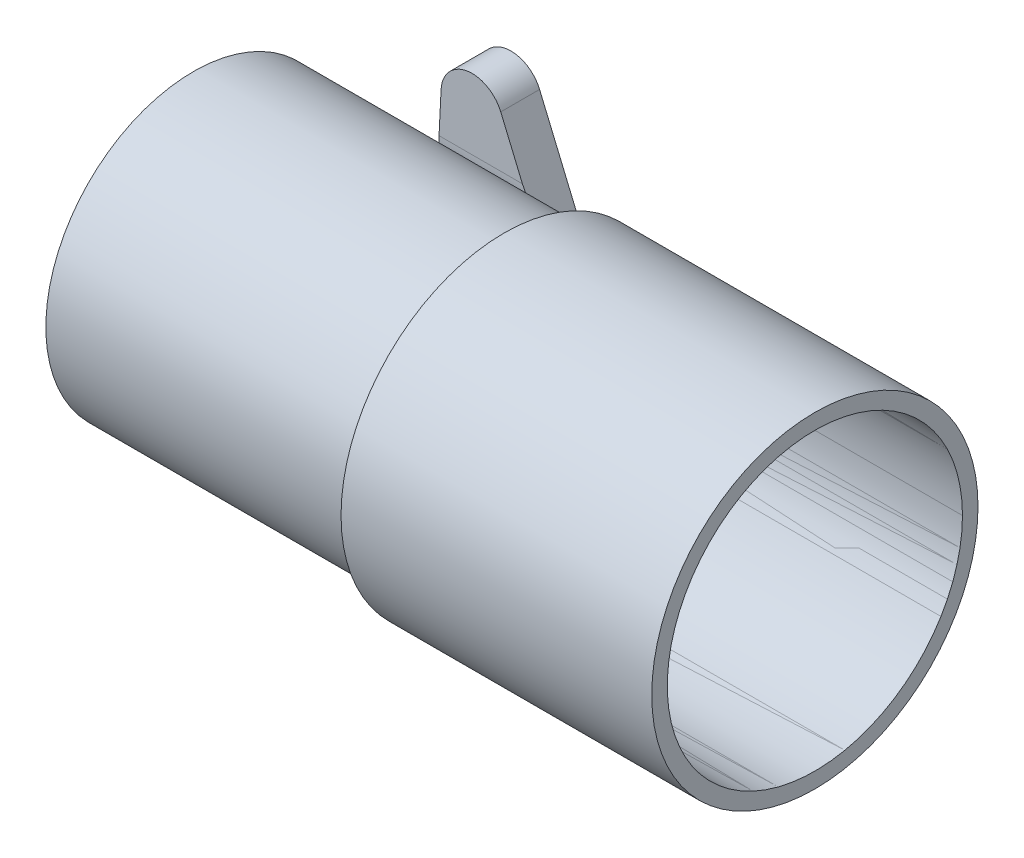
ISO-10303-21;
HEADER;
FILE_DESCRIPTION(('STEP AP214'),'2;1');
FILE_NAME('part.step','',(''),(''),'','','');
FILE_SCHEMA(('AUTOMOTIVE_DESIGN { 1 0 10303 214 1 1 1 1 }'));
ENDSEC;
DATA;
#1=APPLICATION_CONTEXT('core data for automotive mechanical design processes');
#2=APPLICATION_PROTOCOL_DEFINITION('international standard','automotive_design',2000,#1);
#3=PRODUCT_CONTEXT('',#1,'mechanical');
#4=PRODUCT('Part','Part','',(#3));
#5=PRODUCT_RELATED_PRODUCT_CATEGORY('part','',(#4));
#6=PRODUCT_DEFINITION_FORMATION('','',#4);
#7=PRODUCT_DEFINITION_CONTEXT('part definition',#1,'design');
#8=PRODUCT_DEFINITION('design','',#6,#7);
#9=PRODUCT_DEFINITION_SHAPE('','',#8);
#10=(LENGTH_UNIT() NAMED_UNIT(*) SI_UNIT(.MILLI.,.METRE.));
#11=(NAMED_UNIT(*) PLANE_ANGLE_UNIT() SI_UNIT($,.RADIAN.));
#12=(NAMED_UNIT(*) SI_UNIT($,.STERADIAN.) SOLID_ANGLE_UNIT());
#13=UNCERTAINTY_MEASURE_WITH_UNIT(LENGTH_MEASURE(1.E-05),#10,'distance_accuracy_value','');
#14=(GEOMETRIC_REPRESENTATION_CONTEXT(3) GLOBAL_UNCERTAINTY_ASSIGNED_CONTEXT((#13)) GLOBAL_UNIT_ASSIGNED_CONTEXT((#10,
#11,#12)) REPRESENTATION_CONTEXT('',''));
#15=CARTESIAN_POINT('',(0.,0.,0.));
#16=DIRECTION('',(0.,0.,1.));
#17=DIRECTION('',(1.,0.,0.));
#18=AXIS2_PLACEMENT_3D('',#15,#16,#17);
#19=CARTESIAN_POINT('',(0.,0.,0.));
#20=DIRECTION('',(-1.,0.,0.));
#21=DIRECTION('',(0.,0.,1.));
#22=AXIS2_PLACEMENT_3D('',#19,#20,#21);
#23=CYLINDRICAL_SURFACE('',#22,9.5);
#24=CARTESIAN_POINT('',(-40.,0.,0.));
#25=DIRECTION('',(-1.,0.,0.));
#26=DIRECTION('',(0.,0.,-1.));
#27=AXIS2_PLACEMENT_3D('',#24,#25,#26);
#28=CIRCLE('',#27,9.5);
#29=CARTESIAN_POINT('',(-40.,0.,-9.5));
#30=VERTEX_POINT('',#29);
#31=EDGE_CURVE('E12',#30,#30,#28,.F.);
#32=ORIENTED_EDGE('',*,*,#31,.F.);
#33=EDGE_LOOP('',(#32));
#34=FACE_BOUND('',#33,.T.);
#35=CARTESIAN_POINT('',(-20.,0.,0.));
#36=DIRECTION('',(1.,0.,0.));
#37=DIRECTION('',(0.,0.,-1.));
#38=AXIS2_PLACEMENT_3D('',#35,#36,#37);
#39=CIRCLE('',#38,9.5);
#40=CARTESIAN_POINT('',(-20.,0.,-9.5));
#41=VERTEX_POINT('',#40);
#42=EDGE_CURVE('E62',#41,#41,#39,.F.);
#43=ORIENTED_EDGE('',*,*,#42,.F.);
#44=EDGE_LOOP('',(#43));
#45=FACE_BOUND('',#44,.T.);
#46=ADVANCED_FACE('F55',(#34,#45),#23,.F.);
#47=OPEN_SHELL('',(#46));
#48=SHELL_BASED_SURFACE_MODEL('B2',(#47));
#49=CARTESIAN_POINT('',(-20.,0.,0.));
#50=DIRECTION('',(1.,0.,0.));
#51=DIRECTION('',(0.,0.,-1.));
#52=AXIS2_PLACEMENT_3D('',#49,#50,#51);
#53=CYLINDRICAL_SURFACE('',#52,9.5);
#54=CARTESIAN_POINT('',(-20.,0.,0.));
#55=DIRECTION('',(1.,0.,0.));
#56=DIRECTION('',(0.,0.,-1.));
#57=AXIS2_PLACEMENT_3D('',#54,#55,#56);
#58=CIRCLE('',#57,9.5);
#59=CARTESIAN_POINT('',(-20.,0.,-9.5));
#60=VERTEX_POINT('',#59);
#61=EDGE_CURVE('E115',#60,#60,#58,.T.);
#62=ORIENTED_EDGE('',*,*,#61,.F.);
#63=EDGE_LOOP('',(#62));
#64=FACE_BOUND('',#63,.T.);
#65=CARTESIAN_POINT('',(0.,0.,0.));
#66=DIRECTION('',(1.,0.,0.));
#67=DIRECTION('',(0.,0.,-1.));
#68=AXIS2_PLACEMENT_3D('',#65,#66,#67);
#69=CIRCLE('',#68,9.5);
#70=CARTESIAN_POINT('',(0.,0.,-9.5));
#71=VERTEX_POINT('',#70);
#72=EDGE_CURVE('E121',#71,#71,#69,.T.);
#73=ORIENTED_EDGE('',*,*,#72,.T.);
#74=EDGE_LOOP('',(#73));
#75=FACE_BOUND('',#74,.T.);
#76=ADVANCED_FACE('F108',(#64,#75),#53,.F.);
#77=CARTESIAN_POINT('',(-20.,0.,0.));
#78=DIRECTION('',(1.,0.,0.));
#79=DIRECTION('',(0.,0.,-1.));
#80=AXIS2_PLACEMENT_3D('',#77,#78,#79);
#81=CYLINDRICAL_SURFACE('',#80,10.5);
#82=CARTESIAN_POINT('',(-20.,0.,0.));
#83=DIRECTION('',(1.,0.,0.));
#84=DIRECTION('',(0.,0.,-1.));
#85=AXIS2_PLACEMENT_3D('',#82,#83,#84);
#86=CIRCLE('',#85,10.5);
#87=CARTESIAN_POINT('',(-20.,0.,-10.5));
#88=VERTEX_POINT('',#87);
#89=EDGE_CURVE('E54',#88,#88,#86,.T.);
#90=ORIENTED_EDGE('',*,*,#89,.T.);
#91=EDGE_LOOP('',(#90));
#92=FACE_BOUND('',#91,.T.);
#93=CARTESIAN_POINT('',(0.,0.,0.));
#94=DIRECTION('',(1.,0.,0.));
#95=DIRECTION('',(0.,0.,-1.));
#96=AXIS2_PLACEMENT_3D('',#93,#94,#95);
#97=CIRCLE('',#96,10.5);
#98=CARTESIAN_POINT('',(0.,0.,-10.5));
#99=VERTEX_POINT('',#98);
#100=EDGE_CURVE('E111',#99,#99,#97,.T.);
#101=ORIENTED_EDGE('',*,*,#100,.F.);
#102=EDGE_LOOP('',(#101));
#103=FACE_BOUND('',#102,.T.);
#104=ADVANCED_FACE('F130',(#92,#103),#81,.T.);
#105=CARTESIAN_POINT('',(-20.,0.,0.));
#106=DIRECTION('',(1.,0.,0.));
#107=DIRECTION('',(0.,0.,-1.));
#108=AXIS2_PLACEMENT_3D('',#105,#106,#107);
#109=PLANE('',#108);
#110=ORIENTED_EDGE('',*,*,#61,.T.);
#111=EDGE_LOOP('',(#110));
#112=FACE_BOUND('',#111,.T.);
#113=ORIENTED_EDGE('',*,*,#89,.F.);
#114=EDGE_LOOP('',(#113));
#115=FACE_BOUND('',#114,.T.);
#116=ADVANCED_FACE('F132',(#112,#115),#109,.F.);
#117=CARTESIAN_POINT('',(0.,0.,0.));
#118=DIRECTION('',(1.,0.,0.));
#119=DIRECTION('',(0.,0.,-1.));
#120=AXIS2_PLACEMENT_3D('',#117,#118,#119);
#121=PLANE('',#120);
#122=ORIENTED_EDGE('',*,*,#72,.F.);
#123=EDGE_LOOP('',(#122));
#124=FACE_BOUND('',#123,.T.);
#125=ORIENTED_EDGE('',*,*,#100,.T.);
#126=EDGE_LOOP('',(#125));
#127=FACE_BOUND('',#126,.T.);
#128=ADVANCED_FACE('F128',(#124,#127),#121,.T.);
#129=CLOSED_SHELL('',(#76,#104,#116,#128));
#130=MANIFOLD_SOLID_BREP('B7',#129);
#131=CARTESIAN_POINT('',(-32.9950885850861,-0.801840475083737,6.13056770313551));
#132=DIRECTION('',(-0.998772146271516,0.0495398812290658,0.));
#133=DIRECTION('',(-0.0495398812290658,-0.998772146271516,0.));
#134=AXIS2_PLACEMENT_3D('',#131,#132,#133);
#135=PLANE('',#134);
#136=DIRECTION('',(0.,0.,-1.));
#137=VECTOR('',#136,1.);
#138=CARTESIAN_POINT('',(-32.9950885850861,-0.801840475083736,6.13056770313551));
#139=LINE('',#138,#137);
#140=CARTESIAN_POINT('',(-32.9950885850861,-0.801840475083736,-9.46610013957794));
#141=VERTEX_POINT('',#140);
#142=CARTESIAN_POINT('',(-32.9950885850861,-0.801840475083736,-11.));
#143=VERTEX_POINT('',#142);
#144=EDGE_CURVE('E383',#141,#143,#139,.T.);
#145=ORIENTED_EDGE('',*,*,#144,.F.);
#146=CARTESIAN_POINT('',(-32.9553166690904,0.,0.));
#147=DIRECTION('',(-0.998772146271516,0.0495398812290658,0.));
#148=DIRECTION('',(-0.0495398812290658,-0.998772146271516,0.));
#149=AXIS2_PLACEMENT_3D('',#146,#147,#148);
#150=ELLIPSE('',#149,9.51167895046347,9.5);
#151=CARTESIAN_POINT('',(-32.7844291625645,3.44525819257906,-8.85325906016913));
#152=VERTEX_POINT('',#151);
#153=EDGE_CURVE('E424',#141,#152,#150,.F.);
#154=ORIENTED_EDGE('',*,*,#153,.T.);
#155=CARTESIAN_POINT('',(-32.6910879864736,5.32710700745194,-13.6890345344218));
#156=DIRECTION('',(-0.998772146271516,0.0495398812290658,0.));
#157=DIRECTION('',(-0.0495398812290658,-0.998772146271516,0.));
#158=AXIS2_PLACEMENT_3D('',#155,#156,#157);
#159=ELLIPSE('',#158,5.19541374255661,5.1890345344218);
#160=CARTESIAN_POINT('',(-32.6910879864736,5.32710700745194,-8.5));
#161=VERTEX_POINT('',#160);
#162=EDGE_CURVE('E369',#152,#161,#159,.T.);
#163=ORIENTED_EDGE('',*,*,#162,.T.);
#164=DIRECTION('',(0.0495398812290658,0.998772146271516,0.));
#165=VECTOR('',#164,1.);
#166=CARTESIAN_POINT('',(-32.9950885850861,-0.801840475083737,-8.5));
#167=LINE('',#166,#165);
#168=CARTESIAN_POINT('',(-32.5603778915454,7.96234953956801,-8.5));
#169=VERTEX_POINT('',#168);
#170=EDGE_CURVE('E502',#161,#169,#167,.T.);
#171=ORIENTED_EDGE('',*,*,#170,.T.);
#172=DIRECTION('',(0.,0.,-1.));
#173=VECTOR('',#172,1.);
#174=CARTESIAN_POINT('',(-32.5603778915454,7.96234953956801,6.13056770313551));
#175=LINE('',#174,#173);
#176=CARTESIAN_POINT('',(-32.5603778915454,7.96234953956801,-11.));
#177=VERTEX_POINT('',#176);
#178=EDGE_CURVE('E330',#169,#177,#175,.T.);
#179=ORIENTED_EDGE('',*,*,#178,.T.);
#180=DIRECTION('',(0.0495398812290658,0.998772146271516,0.));
#181=VECTOR('',#180,1.);
#182=CARTESIAN_POINT('',(-32.9950885850861,-0.801840475083737,-11.));
#183=LINE('',#182,#181);
#184=EDGE_CURVE('E395',#143,#177,#183,.T.);
#185=ORIENTED_EDGE('',*,*,#184,.F.);
#186=EDGE_LOOP('',(#145,#154,#163,#171,#179,#185));
#187=FACE_BOUND('',#186,.T.);
#188=ADVANCED_FACE('F326',(#187),#135,.T.);
#189=CARTESIAN_POINT('',(-29.,-1.,6.13056770313551));
#190=DIRECTION('',(0.,0.,-1.));
#191=DIRECTION('',(-1.,0.,0.));
#192=AXIS2_PLACEMENT_3D('',#189,#190,#191);
#193=CYLINDRICAL_SURFACE('',#192,4.);
#194=CARTESIAN_POINT('',(-32.9950885850861,-0.801840475083735,-9.46610013957794));
#195=CARTESIAN_POINT('',(-33.0005265096191,-0.911156153550226,-9.45685833392149));
#196=CARTESIAN_POINT('',(-33.0014377666075,-1.02051514766872,-9.44567032903938));
#197=CARTESIAN_POINT('',(-32.9943696576452,-1.23845138806397,-9.41956410553617));
#198=CARTESIAN_POINT('',(-32.9863942042071,-1.34702895720069,-9.40464753071793));
#199=CARTESIAN_POINT('',(-32.9617725205626,-1.56217172622619,-9.37130920779856));
#200=CARTESIAN_POINT('',(-32.9451634269143,-1.66874353513924,-9.35290268501166));
#201=CARTESIAN_POINT('',(-32.903572628638,-1.87959180732958,-9.31282302552676));
#202=CARTESIAN_POINT('',(-32.8785902627755,-1.98386808863657,-9.29114963091943));
#203=CARTESIAN_POINT('',(-32.791609418137,-2.29193429698376,-9.22177466421712));
#204=CARTESIAN_POINT('',(-32.7175187308076,-2.49145608765971,-9.16963987415505));
#205=CARTESIAN_POINT('',(-32.5399637937317,-2.87439412795317,-9.05692458002463));
#206=CARTESIAN_POINT('',(-32.4364699325976,-3.05779389633061,-8.99633559335422));
#207=CARTESIAN_POINT('',(-32.1956009019808,-3.41610875835946,-8.86671885943163));
#208=CARTESIAN_POINT('',(-32.0565032023417,-3.58976325983169,-8.79739999544139));
#209=CARTESIAN_POINT('',(-31.751451991215,-3.91184165083531,-8.65900066013709));
#210=CARTESIAN_POINT('',(-31.5854813365452,-4.06024930978002,-8.58992036993986));
#211=CARTESIAN_POINT('',(-31.2188244358323,-4.33653147625692,-8.45396860126482));
#212=CARTESIAN_POINT('',(-31.0166634658609,-4.46266719512121,-8.38747083420168));
#213=CARTESIAN_POINT('',(-30.6967412068016,-4.62427845246398,-8.29878568335153));
#214=CARTESIAN_POINT('',(-30.5872883844385,-4.67355976712085,-8.27106153485419));
#215=CARTESIAN_POINT('',(-30.3634839298543,-4.7623626897761,-8.22025034128598));
#216=CARTESIAN_POINT('',(-30.2491355203694,-4.80189060588667,-8.19716030087065));
#217=CARTESIAN_POINT('',(-30.0258212297722,-4.86783341700073,-8.15815832068982));
#218=CARTESIAN_POINT('',(-29.9171662195946,-4.89504938976784,-8.1418173372534));
#219=CARTESIAN_POINT('',(-29.6973635506196,-4.94033787771337,-8.11441707620332));
#220=CARTESIAN_POINT('',(-29.5862173474221,-4.95841559403813,-8.10335479435577));
#221=CARTESIAN_POINT('',(-29.3624554550118,-4.9851365031173,-8.08694389617502));
#222=CARTESIAN_POINT('',(-29.2498408687246,-4.99378640586083,-8.08159121624636));
#223=CARTESIAN_POINT('',(-29.0241647139696,-5.00151977596573,-8.07680766303871));
#224=CARTESIAN_POINT('',(-28.9111031971833,-5.00060431884884,-8.07737612399114));
#225=CARTESIAN_POINT('',(-28.7007517363085,-4.98998836817723,-8.08393754790868));
#226=CARTESIAN_POINT('',(-28.6033764707652,-4.98148022361133,-8.08919421317545));
#227=CARTESIAN_POINT('',(-28.4098160725375,-4.95742467898363,-8.10395771396827));
#228=CARTESIAN_POINT('',(-28.3136313166815,-4.94187510584264,-8.1134658615473));
#229=CARTESIAN_POINT('',(-28.0278919635001,-4.88492432029965,-8.14797858250185));
#230=CARTESIAN_POINT('',(-27.84099992845,-4.83321299113421,-8.17897683641366));
#231=CARTESIAN_POINT('',(-27.4762833631344,-4.70356631689056,-8.25421638254697));
#232=CARTESIAN_POINT('',(-27.2986393964352,-4.62524505332687,-8.2986514382828));
#233=CARTESIAN_POINT('',(-26.9583892687401,-4.44512732716887,-8.39650788638725));
#234=CARTESIAN_POINT('',(-26.7957885796006,-4.34332236926319,-8.44993252887465));
#235=CARTESIAN_POINT('',(-26.4668491019465,-4.1032325069209,-8.56935032370084));
#236=CARTESIAN_POINT('',(-26.3030157720329,-3.96186793323429,-8.63606434085779));
#237=CARTESIAN_POINT('',(-26.0002755692895,-3.6548491306924,-8.77041782182218));
#238=CARTESIAN_POINT('',(-25.8613879819811,-3.48917628738562,-8.83805795850585));
#239=CARTESIAN_POINT('',(-25.6003984183444,-3.12082378128868,-8.97508718617055));
#240=CARTESIAN_POINT('',(-25.4808406034938,-2.91617211851216,-9.04410847657391));
#241=CARTESIAN_POINT('',(-25.3294209870212,-2.59404568022786,-9.13967070655095));
#242=CARTESIAN_POINT('',(-25.2835909784739,-2.48410976056927,-9.17020454357116));
#243=CARTESIAN_POINT('',(-25.2017111465988,-2.25985012887385,-9.22802484433485));
#244=CARTESIAN_POINT('',(-25.1656561847517,-2.14552875838934,-9.25531301000253));
#245=CARTESIAN_POINT('',(-25.1052421667329,-1.91869456277661,-9.30491645861258));
#246=CARTESIAN_POINT('',(-25.0804195609557,-1.80634235820348,-9.32740328947476));
#247=CARTESIAN_POINT('',(-25.0404909659422,-1.57927991446449,-9.36852037950814));
#248=CARTESIAN_POINT('',(-25.0253801214294,-1.46457088321297,-9.38715256259903));
#249=CARTESIAN_POINT('',(-25.0051479737887,-1.23365369376591,-9.42028171571998));
#250=CARTESIAN_POINT('',(-25.0000289506593,-1.11744519950124,-9.43477774129066));
#251=CARTESIAN_POINT('',(-24.9999713153321,-0.884619351037081,-9.45944723733198));
#252=CARTESIAN_POINT('',(-25.0050275190027,-0.768002235242719,-9.46962290576378));
#253=CARTESIAN_POINT('',(-25.024211257166,-0.548522270629481,-9.48471525775075));
#254=CARTESIAN_POINT('',(-25.0372491055815,-0.445594351358677,-9.49009629174772));
#255=CARTESIAN_POINT('',(-25.0713106423623,-0.240948093854355,-9.49749595874174));
#256=CARTESIAN_POINT('',(-25.0923339291334,-0.139229695058326,-9.49951476080069));
#257=CARTESIAN_POINT('',(-25.1422750307587,0.0624306727915454,-9.50033002511025));
#258=CARTESIAN_POINT('',(-25.1712053190629,0.162369567061225,-9.49912136933768));
#259=CARTESIAN_POINT('',(-25.2367241850718,0.359626782682628,-9.4937067460156));
#260=CARTESIAN_POINT('',(-25.273313066105,0.456945000066693,-9.48950065973311));
#261=CARTESIAN_POINT('',(-25.3136192863218,0.552609813772107,-9.48391387527969));
#262=B_SPLINE_CURVE_WITH_KNOTS('',3,(#194,#195,#196,#197,#198,#199,#200,#201,#202,#203,#204,
#205,#206,#207,#208,#209,#210,#211,#212,#213,#214,#215,#216,#217,#218,#219,#220,#221,#222,#223,
#224,#225,#226,#227,#228,#229,#230,#231,#232,#233,#234,#235,#236,#237,#238,#239,#240,#241,#242,
#243,#244,#245,#246,#247,#248,#249,#250,#251,#252,#253,#254,#255,#256,#257,#258,#259,#260,#261),
.UNSPECIFIED.,.F.,.F.,(4,2,2,2,2,2,2,2,2,2,2,2,2,2,2,2,2,2,2,2,2,2,2,2,2,2,2,2,2,2,2,2,2,4),(0.,
0.329385390026268,0.658625820289742,0.98646164000827,1.31432335490977,1.96855340350812,
2.62344466479418,3.31955558925364,4.01611234923081,4.75396211503245,5.12308718641128,
5.49197289282852,5.83107406279011,6.16998201139885,6.5086485936935,6.8472770969863,
7.14057752407837,7.43396852936452,8.02029835892246,8.61552282234891,9.21096294900094,
9.88747666583768,10.56451116424,11.3009847309136,11.6694449176684,12.0377110360799,
12.3889563946549,12.7400260155272,13.0911757363782,13.4421465967933,13.7534555841885,
14.0647489176733,14.3765361855,14.6883358044022),.UNSPECIFIED.);
#263=CARTESIAN_POINT('',(-25.3136192863218,0.552609813772107,-9.48391387527969));
#264=VERTEX_POINT('',#263);
#265=EDGE_CURVE('E389',#141,#264,#262,.T.);
#266=ORIENTED_EDGE('',*,*,#265,.F.);
#267=ORIENTED_EDGE('',*,*,#144,.T.);
#268=CARTESIAN_POINT('',(-29.,-1.,-11.));
#269=DIRECTION('',(0.,0.,1.));
#270=DIRECTION('',(1.,0.,0.));
#271=AXIS2_PLACEMENT_3D('',#268,#269,#270);
#272=CIRCLE('',#271,4.);
#273=CARTESIAN_POINT('',(-25.3136192863218,0.552609813772107,-11.));
#274=VERTEX_POINT('',#273);
#275=EDGE_CURVE('E387',#143,#274,#272,.T.);
#276=ORIENTED_EDGE('',*,*,#275,.T.);
#277=DIRECTION('',(0.,0.,-1.));
#278=VECTOR('',#277,1.);
#279=CARTESIAN_POINT('',(-25.3136192863218,0.552609813772107,6.13056770313551));
#280=LINE('',#279,#278);
#281=EDGE_CURVE('E412',#264,#274,#280,.T.);
#282=ORIENTED_EDGE('',*,*,#281,.F.);
#283=EDGE_LOOP('',(#266,#267,#276,#282));
#284=FACE_BOUND('',#283,.T.);
#285=ADVANCED_FACE('F385',(#284),#193,.T.);
#286=CARTESIAN_POINT('',(-28.7196432421632,8.63957468399593,6.13056770313551));
#287=DIRECTION('',(0.921595178419548,0.388152453443027,0.));
#288=DIRECTION('',(-0.388152453443027,0.921595178419548,0.));
#289=AXIS2_PLACEMENT_3D('',#286,#287,#288);
#290=PLANE('',#289);
#291=CARTESIAN_POINT('',(-27.3245160912094,5.32710700745194,-13.6890345344218));
#292=DIRECTION('',(0.921595178419548,0.388152453443027,0.));
#293=DIRECTION('',(-0.388152453443027,0.921595178419548,0.));
#294=AXIS2_PLACEMENT_3D('',#291,#292,#293);
#295=ELLIPSE('',#294,5.63049227679394,5.1890345344218);
#296=CARTESIAN_POINT('',(-27.3245160912094,5.32710700745194,-8.5));
#297=VERTEX_POINT('',#296);
#298=CARTESIAN_POINT('',(-26.5319292248649,3.44525819257906,-8.85325906016913));
#299=VERTEX_POINT('',#298);
#300=EDGE_CURVE('E398',#297,#299,#295,.T.);
#301=ORIENTED_EDGE('',*,*,#300,.T.);
#302=CARTESIAN_POINT('',(-25.0808740853539,0.,0.));
#303=DIRECTION('',(0.921595178419548,0.388152453443027,0.));
#304=DIRECTION('',(-0.388152453443027,0.921595178419548,0.));
#305=AXIS2_PLACEMENT_3D('',#302,#303,#304);
#306=ELLIPSE('',#305,10.3082136522151,9.5);
#307=EDGE_CURVE('E414',#299,#264,#306,.F.);
#308=ORIENTED_EDGE('',*,*,#307,.T.);
#309=ORIENTED_EDGE('',*,*,#281,.T.);
#310=DIRECTION('',(0.388152453443027,-0.921595178419548,0.));
#311=VECTOR('',#310,1.);
#312=CARTESIAN_POINT('',(-28.7196432421632,8.63957468399593,-11.));
#313=LINE('',#312,#311);
#314=CARTESIAN_POINT('',(-28.7196432421632,8.63957468399593,-11.));
#315=VERTEX_POINT('',#314);
#316=EDGE_CURVE('E397',#315,#274,#313,.T.);
#317=ORIENTED_EDGE('',*,*,#316,.F.);
#318=DIRECTION('',(0.,0.,-1.));
#319=VECTOR('',#318,1.);
#320=CARTESIAN_POINT('',(-28.7196432421632,8.63957468399593,6.13056770313551));
#321=LINE('',#320,#319);
#322=CARTESIAN_POINT('',(-28.7196432421632,8.63957468399593,-8.5));
#323=VERTEX_POINT('',#322);
#324=EDGE_CURVE('E348',#323,#315,#321,.T.);
#325=ORIENTED_EDGE('',*,*,#324,.F.);
#326=DIRECTION('',(0.388152453443027,-0.921595178419548,0.));
#327=VECTOR('',#326,1.);
#328=CARTESIAN_POINT('',(-28.7196432421632,8.63957468399593,-8.5));
#329=LINE('',#328,#327);
#330=EDGE_CURVE('E410',#323,#297,#329,.T.);
#331=ORIENTED_EDGE('',*,*,#330,.T.);
#332=EDGE_LOOP('',(#301,#308,#309,#317,#325,#331));
#333=FACE_BOUND('',#332,.T.);
#334=ADVANCED_FACE('F444',(#333),#290,.T.);
#335=CARTESIAN_POINT('',(-30.5628335990023,7.86326977710988,6.13056770313551));
#336=DIRECTION('',(0.,0.,-1.));
#337=DIRECTION('',(-1.,0.,0.));
#338=AXIS2_PLACEMENT_3D('',#335,#336,#337);
#339=CYLINDRICAL_SURFACE('',#338,2.);
#340=CARTESIAN_POINT('',(-30.5628335990023,7.86326977710988,-8.5));
#341=DIRECTION('',(0.,0.,1.));
#342=DIRECTION('',(1.,0.,0.));
#343=AXIS2_PLACEMENT_3D('',#340,#341,#342);
#344=CIRCLE('',#343,2.);
#345=EDGE_CURVE('E181',#323,#169,#344,.T.);
#346=ORIENTED_EDGE('',*,*,#345,.F.);
#347=ORIENTED_EDGE('',*,*,#324,.T.);
#348=CARTESIAN_POINT('',(-30.5628335990023,7.86326977710988,-11.));
#349=DIRECTION('',(0.,0.,1.));
#350=DIRECTION('',(1.,0.,0.));
#351=AXIS2_PLACEMENT_3D('',#348,#349,#350);
#352=CIRCLE('',#351,2.);
#353=EDGE_CURVE('E400',#315,#177,#352,.T.);
#354=ORIENTED_EDGE('',*,*,#353,.T.);
#355=ORIENTED_EDGE('',*,*,#178,.F.);
#356=EDGE_LOOP('',(#346,#347,#354,#355));
#357=FACE_BOUND('',#356,.T.);
#358=ADVANCED_FACE('F448',(#357),#339,.T.);
#359=CARTESIAN_POINT('',(-30.5628335990023,7.86326977710988,-11.));
#360=DIRECTION('',(0.,0.,1.));
#361=DIRECTION('',(1.,0.,0.));
#362=AXIS2_PLACEMENT_3D('',#359,#360,#361);
#363=PLANE('',#362);
#364=ORIENTED_EDGE('',*,*,#184,.T.);
#365=ORIENTED_EDGE('',*,*,#353,.F.);
#366=ORIENTED_EDGE('',*,*,#316,.T.);
#367=ORIENTED_EDGE('',*,*,#275,.F.);
#368=EDGE_LOOP('',(#364,#365,#366,#367));
#369=FACE_BOUND('',#368,.T.);
#370=ADVANCED_FACE('F394',(#369),#363,.F.);
#371=CARTESIAN_POINT('',(-25.,0.,0.));
#372=DIRECTION('',(-1.,0.,0.));
#373=DIRECTION('',(0.,0.,1.));
#374=AXIS2_PLACEMENT_3D('',#371,#372,#373);
#375=CYLINDRICAL_SURFACE('',#374,9.5);
#376=ORIENTED_EDGE('',*,*,#153,.F.);
#377=ORIENTED_EDGE('',*,*,#265,.T.);
#378=ORIENTED_EDGE('',*,*,#307,.F.);
#379=DIRECTION('',(-1.,0.,0.));
#380=VECTOR('',#379,1.);
#381=CARTESIAN_POINT('',(-25.,3.44525819257906,-8.85325906016913));
#382=LINE('',#381,#380);
#383=EDGE_CURVE('E407',#299,#152,#382,.T.);
#384=ORIENTED_EDGE('',*,*,#383,.T.);
#385=EDGE_LOOP('',(#376,#377,#378,#384));
#386=FACE_BOUND('',#385,.T.);
#387=ADVANCED_FACE('F429',(#386),#375,.F.);
#388=CARTESIAN_POINT('',(-25.,5.32710700745194,-13.6890345344218));
#389=DIRECTION('',(-1.,0.,0.));
#390=DIRECTION('',(0.,0.,1.));
#391=AXIS2_PLACEMENT_3D('',#388,#389,#390);
#392=CYLINDRICAL_SURFACE('',#391,5.1890345344218);
#393=ORIENTED_EDGE('',*,*,#162,.F.);
#394=ORIENTED_EDGE('',*,*,#383,.F.);
#395=ORIENTED_EDGE('',*,*,#300,.F.);
#396=DIRECTION('',(-1.,0.,0.));
#397=VECTOR('',#396,1.);
#398=CARTESIAN_POINT('',(-25.,5.32710700745194,-8.5));
#399=LINE('',#398,#397);
#400=EDGE_CURVE('E335',#297,#161,#399,.T.);
#401=ORIENTED_EDGE('',*,*,#400,.T.);
#402=EDGE_LOOP('',(#393,#394,#395,#401));
#403=FACE_BOUND('',#402,.T.);
#404=ADVANCED_FACE('F432',(#403),#392,.T.);
#405=CARTESIAN_POINT('',(-25.,5.32710700745194,-8.5));
#406=DIRECTION('',(0.,0.,1.));
#407=DIRECTION('',(1.,0.,0.));
#408=AXIS2_PLACEMENT_3D('',#405,#406,#407);
#409=PLANE('',#408);
#410=ORIENTED_EDGE('',*,*,#170,.F.);
#411=ORIENTED_EDGE('',*,*,#400,.F.);
#412=ORIENTED_EDGE('',*,*,#330,.F.);
#413=ORIENTED_EDGE('',*,*,#345,.T.);
#414=EDGE_LOOP('',(#410,#411,#412,#413));
#415=FACE_BOUND('',#414,.T.);
#416=ADVANCED_FACE('F328',(#415),#409,.T.);
#417=CLOSED_SHELL('',(#188,#285,#334,#358,#370,#387,#404,#416));
#418=MANIFOLD_SOLID_BREP('B100',#417);
#419=CARTESIAN_POINT('',(0.,0.,0.));
#420=DIRECTION('',(-1.,0.,0.));
#421=DIRECTION('',(0.,0.,1.));
#422=AXIS2_PLACEMENT_3D('',#419,#420,#421);
#423=CYLINDRICAL_SURFACE('',#422,9.5);
#424=CARTESIAN_POINT('',(0.,0.,0.));
#425=DIRECTION('',(1.,0.,0.));
#426=DIRECTION('',(0.,0.,-1.));
#427=AXIS2_PLACEMENT_3D('',#424,#425,#426);
#428=CIRCLE('',#427,9.5);
#429=CARTESIAN_POINT('',(0.,0.,-9.5));
#430=VERTEX_POINT('',#429);
#431=EDGE_CURVE('E660',#430,#430,#428,.T.);
#432=ORIENTED_EDGE('',*,*,#431,.T.);
#433=EDGE_LOOP('',(#432));
#434=FACE_BOUND('',#433,.T.);
#435=CARTESIAN_POINT('',(-20.,0.,0.));
#436=DIRECTION('',(1.,0.,0.));
#437=DIRECTION('',(0.,0.,-1.));
#438=AXIS2_PLACEMENT_3D('',#435,#436,#437);
#439=CIRCLE('',#438,9.5);
#440=CARTESIAN_POINT('',(-20.,0.,-9.5));
#441=VERTEX_POINT('',#440);
#442=EDGE_CURVE('E630',#441,#441,#439,.T.);
#443=ORIENTED_EDGE('',*,*,#442,.F.);
#444=EDGE_LOOP('',(#443));
#445=FACE_BOUND('',#444,.T.);
#446=ADVANCED_FACE('F656',(#434,#445),#423,.F.);
#447=OPEN_SHELL('',(#446));
#448=SHELL_BASED_SURFACE_MODEL('B510',(#447));
#449=ADVANCED_BREP_SHAPE_REPRESENTATION('',(#18,#130,#418),#14);
#450=MANIFOLD_SURFACE_SHAPE_REPRESENTATION('',(#18,#48,#448),#14);
#451=SHAPE_REPRESENTATION('',(#18),#14);
#452=SHAPE_DEFINITION_REPRESENTATION(#9,#451);
#453=SHAPE_REPRESENTATION_RELATIONSHIP('','',#451,#449);
#454=SHAPE_REPRESENTATION_RELATIONSHIP('','',#451,#450);
ENDSEC;
END-ISO-10303-21;
